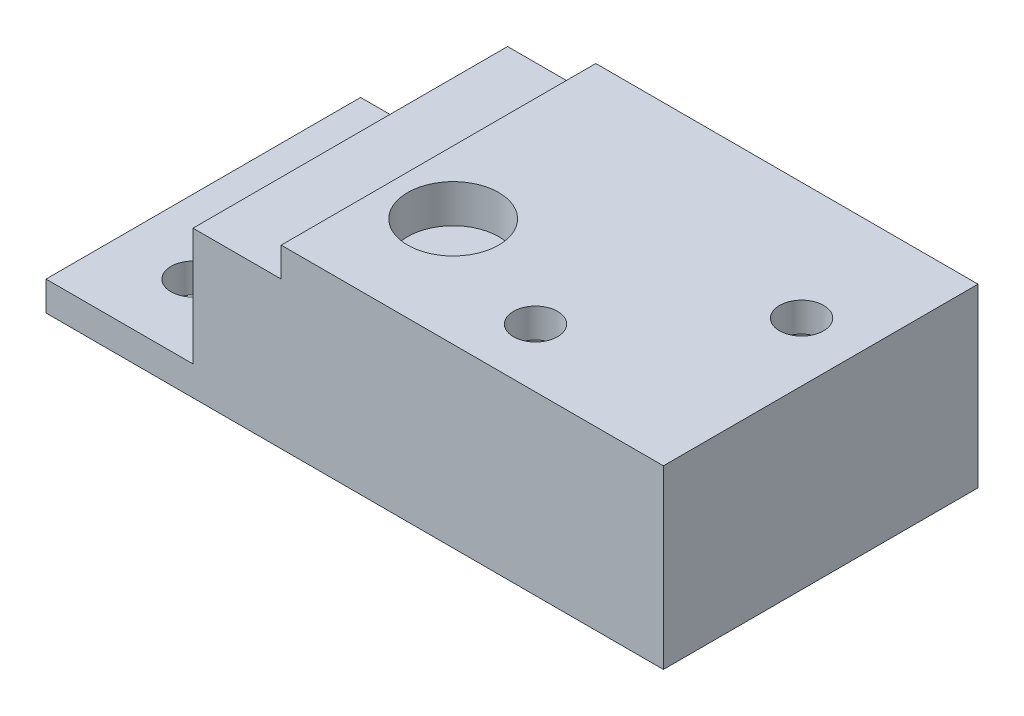
ISO-10303-21;
HEADER;
FILE_DESCRIPTION(('STEP AP214'),'2;1');
FILE_NAME('part.step','',(''),(''),'','','');
FILE_SCHEMA(('AUTOMOTIVE_DESIGN { 1 0 10303 214 1 1 1 1 }'));
ENDSEC;
DATA;
#1=APPLICATION_CONTEXT('core data for automotive mechanical design processes');
#2=APPLICATION_PROTOCOL_DEFINITION('international standard','automotive_design',2000,#1);
#3=PRODUCT_CONTEXT('',#1,'mechanical');
#4=PRODUCT('Part','Part','',(#3));
#5=PRODUCT_RELATED_PRODUCT_CATEGORY('part','',(#4));
#6=PRODUCT_DEFINITION_FORMATION('','',#4);
#7=PRODUCT_DEFINITION_CONTEXT('part definition',#1,'design');
#8=PRODUCT_DEFINITION('design','',#6,#7);
#9=PRODUCT_DEFINITION_SHAPE('','',#8);
#10=(LENGTH_UNIT() NAMED_UNIT(*) SI_UNIT(.MILLI.,.METRE.));
#11=(NAMED_UNIT(*) PLANE_ANGLE_UNIT() SI_UNIT($,.RADIAN.));
#12=(NAMED_UNIT(*) SI_UNIT($,.STERADIAN.) SOLID_ANGLE_UNIT());
#13=UNCERTAINTY_MEASURE_WITH_UNIT(LENGTH_MEASURE(1.E-05),#10,'distance_accuracy_value','');
#14=(GEOMETRIC_REPRESENTATION_CONTEXT(3) GLOBAL_UNCERTAINTY_ASSIGNED_CONTEXT((#13)) GLOBAL_UNIT_ASSIGNED_CONTEXT((#10,
#11,#12)) REPRESENTATION_CONTEXT('',''));
#15=CARTESIAN_POINT('',(0.,0.,0.));
#16=DIRECTION('',(0.,0.,1.));
#17=DIRECTION('',(1.,0.,0.));
#18=AXIS2_PLACEMENT_3D('',#15,#16,#17);
#19=CARTESIAN_POINT('',(0.,-32.,21.4));
#20=DIRECTION('',(0.,0.,-1.));
#21=DIRECTION('',(-1.,0.,0.));
#22=AXIS2_PLACEMENT_3D('',#19,#20,#21);
#23=PLANE('',#22);
#24=DIRECTION('',(0.,-1.,0.));
#25=VECTOR('',#24,1.);
#26=CARTESIAN_POINT('',(16.,-20.,21.4));
#27=LINE('',#26,#25);
#28=CARTESIAN_POINT('',(16.,-20.,21.4));
#29=VERTEX_POINT('',#28);
#30=CARTESIAN_POINT('',(16.,-22.,21.4));
#31=VERTEX_POINT('',#30);
#32=EDGE_CURVE('E127',#29,#31,#27,.T.);
#33=ORIENTED_EDGE('',*,*,#32,.T.);
#34=DIRECTION('',(1.,0.,0.));
#35=VECTOR('',#34,1.);
#36=CARTESIAN_POINT('',(10.,-22.,21.4));
#37=LINE('',#36,#35);
#38=CARTESIAN_POINT('',(10.,-22.,21.4));
#39=VERTEX_POINT('',#38);
#40=EDGE_CURVE('E132',#39,#31,#37,.T.);
#41=ORIENTED_EDGE('',*,*,#40,.F.);
#42=DIRECTION('',(0.,-1.,0.));
#43=VECTOR('',#42,1.);
#44=CARTESIAN_POINT('',(10.,-20.,21.4));
#45=LINE('',#44,#43);
#46=CARTESIAN_POINT('',(10.,-30.,21.4));
#47=VERTEX_POINT('',#46);
#48=EDGE_CURVE('E148',#39,#47,#45,.T.);
#49=ORIENTED_EDGE('',*,*,#48,.T.);
#50=DIRECTION('',(1.,0.,0.));
#51=VECTOR('',#50,1.);
#52=CARTESIAN_POINT('',(0.,-30.,21.4));
#53=LINE('',#52,#51);
#54=CARTESIAN_POINT('',(0.,-30.,21.4));
#55=VERTEX_POINT('',#54);
#56=EDGE_CURVE('E151',#55,#47,#53,.T.);
#57=ORIENTED_EDGE('',*,*,#56,.F.);
#58=DIRECTION('',(0.,1.,0.));
#59=VECTOR('',#58,1.);
#60=CARTESIAN_POINT('',(0.,-32.,21.4));
#61=LINE('',#60,#59);
#62=CARTESIAN_POINT('',(0.,-32.,21.4));
#63=VERTEX_POINT('',#62);
#64=EDGE_CURVE('E169',#63,#55,#61,.T.);
#65=ORIENTED_EDGE('',*,*,#64,.F.);
#66=DIRECTION('',(1.,0.,0.));
#67=VECTOR('',#66,1.);
#68=CARTESIAN_POINT('',(0.,-32.,21.4));
#69=LINE('',#68,#67);
#70=CARTESIAN_POINT('',(42.,-32.,21.4));
#71=VERTEX_POINT('',#70);
#72=EDGE_CURVE('E164',#63,#71,#69,.T.);
#73=ORIENTED_EDGE('',*,*,#72,.T.);
#74=DIRECTION('',(0.,1.,0.));
#75=VECTOR('',#74,1.);
#76=CARTESIAN_POINT('',(42.,-32.,21.4));
#77=LINE('',#76,#75);
#78=CARTESIAN_POINT('',(42.,-20.,21.4));
#79=VERTEX_POINT('',#78);
#80=EDGE_CURVE('E12',#71,#79,#77,.T.);
#81=ORIENTED_EDGE('',*,*,#80,.T.);
#82=DIRECTION('',(1.,0.,0.));
#83=VECTOR('',#82,1.);
#84=CARTESIAN_POINT('',(0.,-20.,21.4));
#85=LINE('',#84,#83);
#86=EDGE_CURVE('E119',#29,#79,#85,.T.);
#87=ORIENTED_EDGE('',*,*,#86,.F.);
#88=EDGE_LOOP('',(#33,#41,#49,#57,#65,#73,#81,#87));
#89=FACE_BOUND('',#88,.T.);
#90=ADVANCED_FACE('F43',(#89),#23,.F.);
#91=CARTESIAN_POINT('',(0.,-32.,0.));
#92=DIRECTION('',(0.,0.,-1.));
#93=DIRECTION('',(-1.,0.,0.));
#94=AXIS2_PLACEMENT_3D('',#91,#92,#93);
#95=PLANE('',#94);
#96=DIRECTION('',(1.,0.,0.));
#97=VECTOR('',#96,1.);
#98=CARTESIAN_POINT('',(0.,-20.,0.));
#99=LINE('',#98,#97);
#100=CARTESIAN_POINT('',(16.,-20.,0.));
#101=VERTEX_POINT('',#100);
#102=CARTESIAN_POINT('',(42.,-20.,0.));
#103=VERTEX_POINT('',#102);
#104=EDGE_CURVE('E121',#101,#103,#99,.T.);
#105=ORIENTED_EDGE('',*,*,#104,.T.);
#106=DIRECTION('',(0.,1.,0.));
#107=VECTOR('',#106,1.);
#108=CARTESIAN_POINT('',(42.,-32.,0.));
#109=LINE('',#108,#107);
#110=CARTESIAN_POINT('',(42.,-32.,0.));
#111=VERTEX_POINT('',#110);
#112=EDGE_CURVE('E51',#111,#103,#109,.T.);
#113=ORIENTED_EDGE('',*,*,#112,.F.);
#114=DIRECTION('',(1.,0.,0.));
#115=VECTOR('',#114,1.);
#116=CARTESIAN_POINT('',(0.,-32.,0.));
#117=LINE('',#116,#115);
#118=CARTESIAN_POINT('',(0.,-32.,0.));
#119=VERTEX_POINT('',#118);
#120=EDGE_CURVE('E167',#119,#111,#117,.T.);
#121=ORIENTED_EDGE('',*,*,#120,.F.);
#122=DIRECTION('',(0.,1.,0.));
#123=VECTOR('',#122,1.);
#124=CARTESIAN_POINT('',(0.,-32.,0.));
#125=LINE('',#124,#123);
#126=CARTESIAN_POINT('',(0.,-30.,0.));
#127=VERTEX_POINT('',#126);
#128=EDGE_CURVE('E174',#119,#127,#125,.T.);
#129=ORIENTED_EDGE('',*,*,#128,.T.);
#130=DIRECTION('',(1.,0.,0.));
#131=VECTOR('',#130,1.);
#132=CARTESIAN_POINT('',(0.,-30.,0.));
#133=LINE('',#132,#131);
#134=CARTESIAN_POINT('',(10.,-30.,0.));
#135=VERTEX_POINT('',#134);
#136=EDGE_CURVE('E152',#127,#135,#133,.T.);
#137=ORIENTED_EDGE('',*,*,#136,.T.);
#138=DIRECTION('',(0.,-1.,0.));
#139=VECTOR('',#138,1.);
#140=CARTESIAN_POINT('',(10.,-20.,0.));
#141=LINE('',#140,#139);
#142=CARTESIAN_POINT('',(10.,-22.,0.));
#143=VERTEX_POINT('',#142);
#144=EDGE_CURVE('E156',#143,#135,#141,.T.);
#145=ORIENTED_EDGE('',*,*,#144,.F.);
#146=DIRECTION('',(1.,0.,0.));
#147=VECTOR('',#146,1.);
#148=CARTESIAN_POINT('',(10.,-22.,0.));
#149=LINE('',#148,#147);
#150=CARTESIAN_POINT('',(16.,-22.,0.));
#151=VERTEX_POINT('',#150);
#152=EDGE_CURVE('E133',#143,#151,#149,.T.);
#153=ORIENTED_EDGE('',*,*,#152,.T.);
#154=DIRECTION('',(0.,-1.,0.));
#155=VECTOR('',#154,1.);
#156=CARTESIAN_POINT('',(16.,-20.,0.));
#157=LINE('',#156,#155);
#158=EDGE_CURVE('E138',#101,#151,#157,.T.);
#159=ORIENTED_EDGE('',*,*,#158,.F.);
#160=EDGE_LOOP('',(#105,#113,#121,#129,#137,#145,#153,#159));
#161=FACE_BOUND('',#160,.T.);
#162=ADVANCED_FACE('F243',(#161),#95,.T.);
#163=CARTESIAN_POINT('',(0.,-20.,0.));
#164=DIRECTION('',(0.,-1.,0.));
#165=DIRECTION('',(0.,0.,1.));
#166=AXIS2_PLACEMENT_3D('',#163,#164,#165);
#167=PLANE('',#166);
#168=CARTESIAN_POINT('',(38.,-20.,8.00000000000001));
#169=DIRECTION('',(0.,1.,0.));
#170=DIRECTION('',(0.,0.,1.));
#171=AXIS2_PLACEMENT_3D('',#168,#169,#170);
#172=CIRCLE('',#171,1.5);
#173=CARTESIAN_POINT('',(38.,-20.,9.50000000000002));
#174=VERTEX_POINT('',#173);
#175=EDGE_CURVE('E219',#174,#174,#172,.T.);
#176=ORIENTED_EDGE('',*,*,#175,.F.);
#177=EDGE_LOOP('',(#176));
#178=FACE_BOUND('',#177,.T.);
#179=CARTESIAN_POINT('',(29.3,-20.,17.4));
#180=DIRECTION('',(0.,1.,0.));
#181=DIRECTION('',(0.,0.,1.));
#182=AXIS2_PLACEMENT_3D('',#179,#180,#181);
#183=CIRCLE('',#182,1.5);
#184=CARTESIAN_POINT('',(29.3,-20.,18.9));
#185=VERTEX_POINT('',#184);
#186=EDGE_CURVE('E222',#185,#185,#183,.T.);
#187=ORIENTED_EDGE('',*,*,#186,.F.);
#188=EDGE_LOOP('',(#187));
#189=FACE_BOUND('',#188,.T.);
#190=CARTESIAN_POINT('',(20.3,-20.,14.));
#191=DIRECTION('',(0.,-1.,0.));
#192=DIRECTION('',(0.,0.,-1.));
#193=AXIS2_PLACEMENT_3D('',#190,#191,#192);
#194=CIRCLE('',#193,3.1);
#195=CARTESIAN_POINT('',(20.3,-20.,10.9));
#196=VERTEX_POINT('',#195);
#197=EDGE_CURVE('E141',#196,#196,#194,.T.);
#198=ORIENTED_EDGE('',*,*,#197,.T.);
#199=EDGE_LOOP('',(#198));
#200=FACE_BOUND('',#199,.T.);
#201=DIRECTION('',(0.,0.,-1.));
#202=VECTOR('',#201,1.);
#203=CARTESIAN_POINT('',(16.,-20.,21.4));
#204=LINE('',#203,#202);
#205=EDGE_CURVE('E59',#29,#101,#204,.T.);
#206=ORIENTED_EDGE('',*,*,#205,.F.);
#207=ORIENTED_EDGE('',*,*,#86,.T.);
#208=DIRECTION('',(0.,0.,-1.));
#209=VECTOR('',#208,1.);
#210=CARTESIAN_POINT('',(42.,-20.,0.));
#211=LINE('',#210,#209);
#212=EDGE_CURVE('E83',#79,#103,#211,.T.);
#213=ORIENTED_EDGE('',*,*,#212,.T.);
#214=ORIENTED_EDGE('',*,*,#104,.F.);
#215=EDGE_LOOP('',(#206,#207,#213,#214));
#216=FACE_BOUND('',#215,.T.);
#217=ADVANCED_FACE('F118',(#178,#189,#200,#216),#167,.F.);
#218=CARTESIAN_POINT('',(42.,-32.,0.));
#219=DIRECTION('',(-1.,0.,0.));
#220=DIRECTION('',(0.,0.,1.));
#221=AXIS2_PLACEMENT_3D('',#218,#219,#220);
#222=PLANE('',#221);
#223=ORIENTED_EDGE('',*,*,#212,.F.);
#224=ORIENTED_EDGE('',*,*,#80,.F.);
#225=DIRECTION('',(0.,0.,-1.));
#226=VECTOR('',#225,1.);
#227=CARTESIAN_POINT('',(42.,-32.,0.));
#228=LINE('',#227,#226);
#229=EDGE_CURVE('E90',#71,#111,#228,.T.);
#230=ORIENTED_EDGE('',*,*,#229,.T.);
#231=ORIENTED_EDGE('',*,*,#112,.T.);
#232=EDGE_LOOP('',(#223,#224,#230,#231));
#233=FACE_BOUND('',#232,.T.);
#234=ADVANCED_FACE('F252',(#233),#222,.F.);
#235=CARTESIAN_POINT('',(0.,-32.,0.));
#236=DIRECTION('',(-1.,0.,0.));
#237=DIRECTION('',(0.,0.,1.));
#238=AXIS2_PLACEMENT_3D('',#235,#236,#237);
#239=PLANE('',#238);
#240=DIRECTION('',(0.,0.,-1.));
#241=VECTOR('',#240,1.);
#242=CARTESIAN_POINT('',(0.,-30.,21.4));
#243=LINE('',#242,#241);
#244=EDGE_CURVE('E155',#55,#127,#243,.T.);
#245=ORIENTED_EDGE('',*,*,#244,.T.);
#246=ORIENTED_EDGE('',*,*,#128,.F.);
#247=DIRECTION('',(0.,0.,-1.));
#248=VECTOR('',#247,1.);
#249=CARTESIAN_POINT('',(0.,-32.,0.));
#250=LINE('',#249,#248);
#251=EDGE_CURVE('E68',#63,#119,#250,.T.);
#252=ORIENTED_EDGE('',*,*,#251,.F.);
#253=ORIENTED_EDGE('',*,*,#64,.T.);
#254=EDGE_LOOP('',(#245,#246,#252,#253));
#255=FACE_BOUND('',#254,.T.);
#256=ADVANCED_FACE('F256',(#255),#239,.T.);
#257=CARTESIAN_POINT('',(0.,-32.,0.));
#258=DIRECTION('',(0.,-1.,0.));
#259=DIRECTION('',(0.,0.,1.));
#260=AXIS2_PLACEMENT_3D('',#257,#258,#259);
#261=PLANE('',#260);
#262=CARTESIAN_POINT('',(4.99999999999999,-32.,16.4));
#263=DIRECTION('',(0.,1.,0.));
#264=DIRECTION('',(0.,0.,1.));
#265=AXIS2_PLACEMENT_3D('',#262,#263,#264);
#266=CIRCLE('',#265,1.5);
#267=CARTESIAN_POINT('',(4.99999999999999,-32.,17.9));
#268=VERTEX_POINT('',#267);
#269=EDGE_CURVE('E218',#268,#268,#266,.T.);
#270=ORIENTED_EDGE('',*,*,#269,.T.);
#271=EDGE_LOOP('',(#270));
#272=FACE_BOUND('',#271,.T.);
#273=CARTESIAN_POINT('',(4.99999999999999,-32.,5.00000000000003));
#274=DIRECTION('',(0.,1.,0.));
#275=DIRECTION('',(0.,0.,1.));
#276=AXIS2_PLACEMENT_3D('',#273,#274,#275);
#277=CIRCLE('',#276,1.5);
#278=CARTESIAN_POINT('',(4.99999999999999,-32.,6.50000000000003));
#279=VERTEX_POINT('',#278);
#280=EDGE_CURVE('E182',#279,#279,#277,.T.);
#281=ORIENTED_EDGE('',*,*,#280,.T.);
#282=EDGE_LOOP('',(#281));
#283=FACE_BOUND('',#282,.T.);
#284=CARTESIAN_POINT('',(38.,-32.,8.00000000000001));
#285=DIRECTION('',(0.,1.,0.));
#286=DIRECTION('',(0.,0.,1.));
#287=AXIS2_PLACEMENT_3D('',#284,#285,#286);
#288=CIRCLE('',#287,2.25);
#289=CARTESIAN_POINT('',(38.,-32.,10.25));
#290=VERTEX_POINT('',#289);
#291=EDGE_CURVE('E198',#290,#290,#288,.T.);
#292=ORIENTED_EDGE('',*,*,#291,.T.);
#293=EDGE_LOOP('',(#292));
#294=FACE_BOUND('',#293,.T.);
#295=CARTESIAN_POINT('',(29.3,-32.,17.4));
#296=DIRECTION('',(0.,1.,0.));
#297=DIRECTION('',(0.,0.,1.));
#298=AXIS2_PLACEMENT_3D('',#295,#296,#297);
#299=CIRCLE('',#298,2.25000000000001);
#300=CARTESIAN_POINT('',(29.3,-32.,19.65));
#301=VERTEX_POINT('',#300);
#302=EDGE_CURVE('E193',#301,#301,#299,.T.);
#303=ORIENTED_EDGE('',*,*,#302,.T.);
#304=EDGE_LOOP('',(#303));
#305=FACE_BOUND('',#304,.T.);
#306=ORIENTED_EDGE('',*,*,#72,.F.);
#307=ORIENTED_EDGE('',*,*,#251,.T.);
#308=ORIENTED_EDGE('',*,*,#120,.T.);
#309=ORIENTED_EDGE('',*,*,#229,.F.);
#310=EDGE_LOOP('',(#306,#307,#308,#309));
#311=FACE_BOUND('',#310,.T.);
#312=ADVANCED_FACE('F228',(#272,#283,#294,#305,#311),#261,.T.);
#313=CARTESIAN_POINT('',(16.,-20.,21.4));
#314=DIRECTION('',(-1.,0.,0.));
#315=DIRECTION('',(0.,0.,1.));
#316=AXIS2_PLACEMENT_3D('',#313,#314,#315);
#317=PLANE('',#316);
#318=ORIENTED_EDGE('',*,*,#158,.T.);
#319=DIRECTION('',(0.,0.,-1.));
#320=VECTOR('',#319,1.);
#321=CARTESIAN_POINT('',(16.,-22.,21.4));
#322=LINE('',#321,#320);
#323=EDGE_CURVE('E122',#31,#151,#322,.T.);
#324=ORIENTED_EDGE('',*,*,#323,.F.);
#325=ORIENTED_EDGE('',*,*,#32,.F.);
#326=ORIENTED_EDGE('',*,*,#205,.T.);
#327=EDGE_LOOP('',(#318,#324,#325,#326));
#328=FACE_BOUND('',#327,.T.);
#329=ADVANCED_FACE('F130',(#328),#317,.T.);
#330=CARTESIAN_POINT('',(10.,-22.,21.4));
#331=DIRECTION('',(0.,-1.,0.));
#332=DIRECTION('',(-1.,0.,0.));
#333=AXIS2_PLACEMENT_3D('',#330,#331,#332);
#334=PLANE('',#333);
#335=ORIENTED_EDGE('',*,*,#152,.F.);
#336=DIRECTION('',(0.,0.,-1.));
#337=VECTOR('',#336,1.);
#338=CARTESIAN_POINT('',(10.,-22.,21.4));
#339=LINE('',#338,#337);
#340=EDGE_CURVE('E135',#39,#143,#339,.T.);
#341=ORIENTED_EDGE('',*,*,#340,.F.);
#342=ORIENTED_EDGE('',*,*,#40,.T.);
#343=ORIENTED_EDGE('',*,*,#323,.T.);
#344=EDGE_LOOP('',(#335,#341,#342,#343));
#345=FACE_BOUND('',#344,.T.);
#346=ADVANCED_FACE('F267',(#345),#334,.F.);
#347=CARTESIAN_POINT('',(0.,-30.,21.4));
#348=DIRECTION('',(0.,-1.,0.));
#349=DIRECTION('',(-1.,0.,0.));
#350=AXIS2_PLACEMENT_3D('',#347,#348,#349);
#351=PLANE('',#350);
#352=CARTESIAN_POINT('',(4.99999999999999,-30.,16.4));
#353=DIRECTION('',(0.,1.,0.));
#354=DIRECTION('',(-1.,0.,0.));
#355=AXIS2_PLACEMENT_3D('',#352,#353,#354);
#356=CIRCLE('',#355,1.5);
#357=CARTESIAN_POINT('',(4.99999999999999,-30.,17.9));
#358=VERTEX_POINT('',#357);
#359=EDGE_CURVE('E46',#358,#358,#356,.T.);
#360=ORIENTED_EDGE('',*,*,#359,.F.);
#361=EDGE_LOOP('',(#360));
#362=FACE_BOUND('',#361,.T.);
#363=CARTESIAN_POINT('',(4.99999999999999,-30.,5.00000000000003));
#364=DIRECTION('',(0.,1.,0.));
#365=DIRECTION('',(-1.,0.,0.));
#366=AXIS2_PLACEMENT_3D('',#363,#364,#365);
#367=CIRCLE('',#366,1.5);
#368=CARTESIAN_POINT('',(4.99999999999999,-30.,6.50000000000003));
#369=VERTEX_POINT('',#368);
#370=EDGE_CURVE('E184',#369,#369,#367,.T.);
#371=ORIENTED_EDGE('',*,*,#370,.F.);
#372=EDGE_LOOP('',(#371));
#373=FACE_BOUND('',#372,.T.);
#374=ORIENTED_EDGE('',*,*,#136,.F.);
#375=ORIENTED_EDGE('',*,*,#244,.F.);
#376=ORIENTED_EDGE('',*,*,#56,.T.);
#377=DIRECTION('',(0.,0.,-1.));
#378=VECTOR('',#377,1.);
#379=CARTESIAN_POINT('',(10.,-30.,21.4));
#380=LINE('',#379,#378);
#381=EDGE_CURVE('E144',#47,#135,#380,.T.);
#382=ORIENTED_EDGE('',*,*,#381,.T.);
#383=EDGE_LOOP('',(#374,#375,#376,#382));
#384=FACE_BOUND('',#383,.T.);
#385=ADVANCED_FACE('F275',(#362,#373,#384),#351,.F.);
#386=CARTESIAN_POINT('',(10.,-20.,21.4));
#387=DIRECTION('',(-1.,0.,0.));
#388=DIRECTION('',(0.,0.,1.));
#389=AXIS2_PLACEMENT_3D('',#386,#387,#388);
#390=PLANE('',#389);
#391=ORIENTED_EDGE('',*,*,#48,.F.);
#392=ORIENTED_EDGE('',*,*,#340,.T.);
#393=ORIENTED_EDGE('',*,*,#144,.T.);
#394=ORIENTED_EDGE('',*,*,#381,.F.);
#395=EDGE_LOOP('',(#391,#392,#393,#394));
#396=FACE_BOUND('',#395,.T.);
#397=ADVANCED_FACE('F272',(#396),#390,.T.);
#398=CARTESIAN_POINT('',(20.3,-22.6,14.));
#399=DIRECTION('',(0.,1.,0.));
#400=DIRECTION('',(0.,0.,-1.));
#401=AXIS2_PLACEMENT_3D('',#398,#399,#400);
#402=CYLINDRICAL_SURFACE('',#401,3.1);
#403=CARTESIAN_POINT('',(20.3,-22.6,14.));
#404=DIRECTION('',(0.,-1.,0.));
#405=DIRECTION('',(0.,0.,-1.));
#406=AXIS2_PLACEMENT_3D('',#403,#404,#405);
#407=CIRCLE('',#406,3.1);
#408=CARTESIAN_POINT('',(20.3,-22.6,10.9));
#409=VERTEX_POINT('',#408);
#410=EDGE_CURVE('E159',#409,#409,#407,.T.);
#411=ORIENTED_EDGE('',*,*,#410,.T.);
#412=EDGE_LOOP('',(#411));
#413=FACE_BOUND('',#412,.T.);
#414=ORIENTED_EDGE('',*,*,#197,.F.);
#415=EDGE_LOOP('',(#414));
#416=FACE_BOUND('',#415,.T.);
#417=ADVANCED_FACE('F285',(#413,#416),#402,.F.);
#418=CARTESIAN_POINT('',(20.3,-22.6,14.));
#419=DIRECTION('',(0.,1.,0.));
#420=DIRECTION('',(0.,0.,-1.));
#421=AXIS2_PLACEMENT_3D('',#418,#419,#420);
#422=PLANE('',#421);
#423=ORIENTED_EDGE('',*,*,#410,.F.);
#424=EDGE_LOOP('',(#423));
#425=FACE_BOUND('',#424,.T.);
#426=ADVANCED_FACE('F293',(#425),#422,.T.);
#427=CARTESIAN_POINT('',(29.3,-13.6360389693211,17.4));
#428=DIRECTION('',(0.,-1.,0.));
#429=DIRECTION('',(0.,0.,1.));
#430=AXIS2_PLACEMENT_3D('',#427,#428,#429);
#431=CYLINDRICAL_SURFACE('',#430,2.25000000000001);
#432=CARTESIAN_POINT('',(29.3,-22.,17.4));
#433=DIRECTION('',(0.,1.,0.));
#434=DIRECTION('',(0.,0.,1.));
#435=AXIS2_PLACEMENT_3D('',#432,#433,#434);
#436=CIRCLE('',#435,2.25000000000001);
#437=CARTESIAN_POINT('',(29.3,-22.,19.65));
#438=VERTEX_POINT('',#437);
#439=EDGE_CURVE('E189',#438,#438,#436,.F.);
#440=ORIENTED_EDGE('',*,*,#439,.F.);
#441=EDGE_LOOP('',(#440));
#442=FACE_BOUND('',#441,.T.);
#443=ORIENTED_EDGE('',*,*,#302,.F.);
#444=EDGE_LOOP('',(#443));
#445=FACE_BOUND('',#444,.T.);
#446=ADVANCED_FACE('F296',(#442,#445),#431,.F.);
#447=CARTESIAN_POINT('',(0.,-22.,0.));
#448=DIRECTION('',(0.,-1.,0.));
#449=DIRECTION('',(0.,0.,1.));
#450=AXIS2_PLACEMENT_3D('',#447,#448,#449);
#451=PLANE('',#450);
#452=CARTESIAN_POINT('',(29.3,-22.,17.4));
#453=DIRECTION('',(0.,1.,0.));
#454=DIRECTION('',(0.,0.,1.));
#455=AXIS2_PLACEMENT_3D('',#452,#453,#454);
#456=CIRCLE('',#455,1.5);
#457=CARTESIAN_POINT('',(29.3,-22.,18.9));
#458=VERTEX_POINT('',#457);
#459=EDGE_CURVE('E181',#458,#458,#456,.T.);
#460=ORIENTED_EDGE('',*,*,#459,.T.);
#461=EDGE_LOOP('',(#460));
#462=FACE_BOUND('',#461,.T.);
#463=ORIENTED_EDGE('',*,*,#439,.T.);
#464=EDGE_LOOP('',(#463));
#465=FACE_BOUND('',#464,.T.);
#466=ADVANCED_FACE('F298',(#462,#465),#451,.T.);
#467=CARTESIAN_POINT('',(38.,-13.6360389693211,8.00000000000001));
#468=DIRECTION('',(0.,-1.,0.));
#469=DIRECTION('',(0.,0.,1.));
#470=AXIS2_PLACEMENT_3D('',#467,#468,#469);
#471=CYLINDRICAL_SURFACE('',#470,2.25);
#472=CARTESIAN_POINT('',(38.,-22.,8.00000000000001));
#473=DIRECTION('',(0.,1.,0.));
#474=DIRECTION('',(0.,0.,1.));
#475=AXIS2_PLACEMENT_3D('',#472,#473,#474);
#476=CIRCLE('',#475,2.25);
#477=CARTESIAN_POINT('',(38.,-22.,10.25));
#478=VERTEX_POINT('',#477);
#479=EDGE_CURVE('E201',#478,#478,#476,.F.);
#480=ORIENTED_EDGE('',*,*,#479,.F.);
#481=EDGE_LOOP('',(#480));
#482=FACE_BOUND('',#481,.T.);
#483=ORIENTED_EDGE('',*,*,#291,.F.);
#484=EDGE_LOOP('',(#483));
#485=FACE_BOUND('',#484,.T.);
#486=ADVANCED_FACE('F301',(#482,#485),#471,.F.);
#487=CARTESIAN_POINT('',(0.,-22.,0.));
#488=DIRECTION('',(0.,-1.,0.));
#489=DIRECTION('',(0.,0.,1.));
#490=AXIS2_PLACEMENT_3D('',#487,#488,#489);
#491=PLANE('',#490);
#492=CARTESIAN_POINT('',(38.,-22.,8.00000000000001));
#493=DIRECTION('',(0.,1.,0.));
#494=DIRECTION('',(0.,0.,1.));
#495=AXIS2_PLACEMENT_3D('',#492,#493,#494);
#496=CIRCLE('',#495,1.5);
#497=CARTESIAN_POINT('',(38.,-22.,9.50000000000002));
#498=VERTEX_POINT('',#497);
#499=EDGE_CURVE('E178',#498,#498,#496,.T.);
#500=ORIENTED_EDGE('',*,*,#499,.T.);
#501=EDGE_LOOP('',(#500));
#502=FACE_BOUND('',#501,.T.);
#503=ORIENTED_EDGE('',*,*,#479,.T.);
#504=EDGE_LOOP('',(#503));
#505=FACE_BOUND('',#504,.T.);
#506=ADVANCED_FACE('F308',(#502,#505),#491,.T.);
#507=CARTESIAN_POINT('',(38.,-20.,8.00000000000001));
#508=DIRECTION('',(0.,-1.,0.));
#509=DIRECTION('',(0.,0.,1.));
#510=AXIS2_PLACEMENT_3D('',#507,#508,#509);
#511=CYLINDRICAL_SURFACE('',#510,1.5);
#512=CARTESIAN_POINT('',(38.,-22.,9.50000000000002));
#513=CARTESIAN_POINT('',(38.,-21.9791666666667,9.50000000000002));
#514=CARTESIAN_POINT('',(38.,-21.9583333333333,9.50000000000002));
#515=CARTESIAN_POINT('',(38.,-21.9166666666667,9.50000000000002));
#516=CARTESIAN_POINT('',(38.,-21.8958333333333,9.50000000000002));
#517=CARTESIAN_POINT('',(38.,-21.8541666666667,9.50000000000002));
#518=CARTESIAN_POINT('',(38.,-21.8333333333333,9.50000000000002));
#519=CARTESIAN_POINT('',(38.,-21.7916666666667,9.50000000000002));
#520=CARTESIAN_POINT('',(38.,-21.7708333333333,9.50000000000002));
#521=CARTESIAN_POINT('',(38.,-21.7291666666667,9.50000000000002));
#522=CARTESIAN_POINT('',(38.,-21.7083333333333,9.50000000000002));
#523=CARTESIAN_POINT('',(38.,-21.6666666666667,9.50000000000002));
#524=CARTESIAN_POINT('',(38.,-21.6458333333333,9.50000000000002));
#525=CARTESIAN_POINT('',(38.,-21.6041666666667,9.50000000000002));
#526=CARTESIAN_POINT('',(38.,-21.5833333333333,9.50000000000002));
#527=CARTESIAN_POINT('',(38.,-21.5416666666667,9.50000000000002));
#528=CARTESIAN_POINT('',(38.,-21.5208333333333,9.50000000000002));
#529=CARTESIAN_POINT('',(38.,-21.4791666666667,9.50000000000002));
#530=CARTESIAN_POINT('',(38.,-21.4583333333333,9.50000000000002));
#531=CARTESIAN_POINT('',(38.,-21.4166666666667,9.50000000000002));
#532=CARTESIAN_POINT('',(38.,-21.3958333333333,9.50000000000002));
#533=CARTESIAN_POINT('',(38.,-21.3541666666667,9.50000000000002));
#534=CARTESIAN_POINT('',(38.,-21.3333333333333,9.50000000000002));
#535=CARTESIAN_POINT('',(38.,-21.2916666666667,9.50000000000002));
#536=CARTESIAN_POINT('',(38.,-21.2708333333333,9.50000000000002));
#537=CARTESIAN_POINT('',(38.,-21.2291666666667,9.50000000000002));
#538=CARTESIAN_POINT('',(38.,-21.2083333333333,9.50000000000002));
#539=CARTESIAN_POINT('',(38.,-21.1666666666667,9.50000000000002));
#540=CARTESIAN_POINT('',(38.,-21.1458333333333,9.50000000000002));
#541=CARTESIAN_POINT('',(38.,-21.1041666666667,9.50000000000002));
#542=CARTESIAN_POINT('',(38.,-21.0833333333333,9.50000000000002));
#543=CARTESIAN_POINT('',(38.,-21.0416666666667,9.50000000000002));
#544=CARTESIAN_POINT('',(38.,-21.0208333333333,9.50000000000002));
#545=CARTESIAN_POINT('',(38.,-20.9791666666667,9.50000000000002));
#546=CARTESIAN_POINT('',(38.,-20.9583333333333,9.50000000000002));
#547=CARTESIAN_POINT('',(38.,-20.9166666666667,9.50000000000002));
#548=CARTESIAN_POINT('',(38.,-20.8958333333333,9.50000000000002));
#549=CARTESIAN_POINT('',(38.,-20.8541666666667,9.50000000000002));
#550=CARTESIAN_POINT('',(38.,-20.8333333333333,9.50000000000002));
#551=CARTESIAN_POINT('',(38.,-20.7916666666667,9.50000000000002));
#552=CARTESIAN_POINT('',(38.,-20.7708333333333,9.50000000000002));
#553=CARTESIAN_POINT('',(38.,-20.7291666666667,9.50000000000002));
#554=CARTESIAN_POINT('',(38.,-20.7083333333333,9.50000000000002));
#555=CARTESIAN_POINT('',(38.,-20.6666666666667,9.50000000000002));
#556=CARTESIAN_POINT('',(38.,-20.6458333333333,9.50000000000002));
#557=CARTESIAN_POINT('',(38.,-20.6041666666667,9.50000000000002));
#558=CARTESIAN_POINT('',(38.,-20.5833333333333,9.50000000000002));
#559=CARTESIAN_POINT('',(38.,-20.5416666666667,9.50000000000002));
#560=CARTESIAN_POINT('',(38.,-20.5208333333333,9.50000000000002));
#561=CARTESIAN_POINT('',(38.,-20.4791666666667,9.50000000000002));
#562=CARTESIAN_POINT('',(38.,-20.4583333333333,9.50000000000002));
#563=CARTESIAN_POINT('',(38.,-20.4166666666667,9.50000000000002));
#564=CARTESIAN_POINT('',(38.,-20.3958333333333,9.50000000000002));
#565=CARTESIAN_POINT('',(38.,-20.3541666666667,9.50000000000002));
#566=CARTESIAN_POINT('',(38.,-20.3333333333333,9.50000000000002));
#567=CARTESIAN_POINT('',(38.,-20.2916666666667,9.50000000000002));
#568=CARTESIAN_POINT('',(38.,-20.2708333333333,9.50000000000002));
#569=CARTESIAN_POINT('',(38.,-20.2291666666667,9.50000000000002));
#570=CARTESIAN_POINT('',(38.,-20.2083333333333,9.50000000000002));
#571=CARTESIAN_POINT('',(38.,-20.1666666666667,9.50000000000002));
#572=CARTESIAN_POINT('',(38.,-20.1458333333333,9.50000000000002));
#573=CARTESIAN_POINT('',(38.,-20.1041666666667,9.50000000000002));
#574=CARTESIAN_POINT('',(38.,-20.0833333333333,9.50000000000002));
#575=CARTESIAN_POINT('',(38.,-20.0416666666667,9.50000000000002));
#576=CARTESIAN_POINT('',(38.,-20.0208333333333,9.50000000000002));
#577=CARTESIAN_POINT('',(38.,-20.,9.50000000000002));
#578=B_SPLINE_CURVE_WITH_KNOTS('',3,(#512,#513,#514,#515,#516,#517,#518,#519,#520,#521,#522,
#523,#524,#525,#526,#527,#528,#529,#530,#531,#532,#533,#534,#535,#536,#537,#538,#539,#540,#541,
#542,#543,#544,#545,#546,#547,#548,#549,#550,#551,#552,#553,#554,#555,#556,#557,#558,#559,#560,
#561,#562,#563,#564,#565,#566,#567,#568,#569,#570,#571,#572,#573,#574,#575,#576,#577),
.UNSPECIFIED.,.F.,.F.,(4,2,2,2,2,2,2,2,2,2,2,2,2,2,2,2,2,2,2,2,2,2,2,2,2,2,2,2,2,2,2,2,4),(0.,
0.0625000000000001,0.125,0.1875,0.25,0.3125,0.375,0.4375,0.5,0.5625,0.625000000000001,
0.687500000000001,0.750000000000001,0.812500000000001,0.875000000000001,0.937500000000001,1.,
1.0625,1.125,1.1875,1.25,1.3125,1.375,1.4375,1.5,1.5625,1.625,1.6875,1.75000000000001,
1.81250000000001,1.87500000000001,1.93750000000001,2.00000000000001),.UNSPECIFIED.);
#579=EDGE_CURVE('BSEAM311',#498,#174,#578,.T.);
#580=ORIENTED_EDGE('',*,*,#499,.F.);
#581=ORIENTED_EDGE('',*,*,#175,.T.);
#582=ORIENTED_EDGE('',*,*,#579,.T.);
#583=ORIENTED_EDGE('',*,*,#579,.F.);
#584=EDGE_LOOP('',(#580,#582,#581,#583));
#585=FACE_BOUND('',#584,.T.);
#586=ADVANCED_FACE('F311',(#585),#511,.F.);
#587=CARTESIAN_POINT('',(29.3,-20.,17.4));
#588=DIRECTION('',(0.,-1.,0.));
#589=DIRECTION('',(0.,0.,1.));
#590=AXIS2_PLACEMENT_3D('',#587,#588,#589);
#591=CYLINDRICAL_SURFACE('',#590,1.5);
#592=CARTESIAN_POINT('',(29.3,-22.,18.9));
#593=CARTESIAN_POINT('',(29.3,-21.9791666666667,18.9));
#594=CARTESIAN_POINT('',(29.3,-21.9583333333333,18.9));
#595=CARTESIAN_POINT('',(29.3,-21.9166666666667,18.9));
#596=CARTESIAN_POINT('',(29.3,-21.8958333333333,18.9));
#597=CARTESIAN_POINT('',(29.3,-21.8541666666667,18.9));
#598=CARTESIAN_POINT('',(29.3,-21.8333333333333,18.9));
#599=CARTESIAN_POINT('',(29.3,-21.7916666666667,18.9));
#600=CARTESIAN_POINT('',(29.3,-21.7708333333333,18.9));
#601=CARTESIAN_POINT('',(29.3,-21.7291666666667,18.9));
#602=CARTESIAN_POINT('',(29.3,-21.7083333333333,18.9));
#603=CARTESIAN_POINT('',(29.3,-21.6666666666667,18.9));
#604=CARTESIAN_POINT('',(29.3,-21.6458333333333,18.9));
#605=CARTESIAN_POINT('',(29.3,-21.6041666666667,18.9));
#606=CARTESIAN_POINT('',(29.3,-21.5833333333333,18.9));
#607=CARTESIAN_POINT('',(29.3,-21.5416666666667,18.9));
#608=CARTESIAN_POINT('',(29.3,-21.5208333333333,18.9));
#609=CARTESIAN_POINT('',(29.3,-21.4791666666667,18.9));
#610=CARTESIAN_POINT('',(29.3,-21.4583333333333,18.9));
#611=CARTESIAN_POINT('',(29.3,-21.4166666666667,18.9));
#612=CARTESIAN_POINT('',(29.3,-21.3958333333333,18.9));
#613=CARTESIAN_POINT('',(29.3,-21.3541666666667,18.9));
#614=CARTESIAN_POINT('',(29.3,-21.3333333333333,18.9));
#615=CARTESIAN_POINT('',(29.3,-21.2916666666667,18.9));
#616=CARTESIAN_POINT('',(29.3,-21.2708333333333,18.9));
#617=CARTESIAN_POINT('',(29.3,-21.2291666666667,18.9));
#618=CARTESIAN_POINT('',(29.3,-21.2083333333333,18.9));
#619=CARTESIAN_POINT('',(29.3,-21.1666666666667,18.9));
#620=CARTESIAN_POINT('',(29.3,-21.1458333333333,18.9));
#621=CARTESIAN_POINT('',(29.3,-21.1041666666667,18.9));
#622=CARTESIAN_POINT('',(29.3,-21.0833333333333,18.9));
#623=CARTESIAN_POINT('',(29.3,-21.0416666666667,18.9));
#624=CARTESIAN_POINT('',(29.3,-21.0208333333333,18.9));
#625=CARTESIAN_POINT('',(29.3,-20.9791666666667,18.9));
#626=CARTESIAN_POINT('',(29.3,-20.9583333333333,18.9));
#627=CARTESIAN_POINT('',(29.3,-20.9166666666667,18.9));
#628=CARTESIAN_POINT('',(29.3,-20.8958333333333,18.9));
#629=CARTESIAN_POINT('',(29.3,-20.8541666666667,18.9));
#630=CARTESIAN_POINT('',(29.3,-20.8333333333333,18.9));
#631=CARTESIAN_POINT('',(29.3,-20.7916666666667,18.9));
#632=CARTESIAN_POINT('',(29.3,-20.7708333333333,18.9));
#633=CARTESIAN_POINT('',(29.3,-20.7291666666667,18.9));
#634=CARTESIAN_POINT('',(29.3,-20.7083333333333,18.9));
#635=CARTESIAN_POINT('',(29.3,-20.6666666666667,18.9));
#636=CARTESIAN_POINT('',(29.3,-20.6458333333333,18.9));
#637=CARTESIAN_POINT('',(29.3,-20.6041666666667,18.9));
#638=CARTESIAN_POINT('',(29.3,-20.5833333333333,18.9));
#639=CARTESIAN_POINT('',(29.3,-20.5416666666667,18.9));
#640=CARTESIAN_POINT('',(29.3,-20.5208333333333,18.9));
#641=CARTESIAN_POINT('',(29.3,-20.4791666666667,18.9));
#642=CARTESIAN_POINT('',(29.3,-20.4583333333333,18.9));
#643=CARTESIAN_POINT('',(29.3,-20.4166666666667,18.9));
#644=CARTESIAN_POINT('',(29.3,-20.3958333333333,18.9));
#645=CARTESIAN_POINT('',(29.3,-20.3541666666667,18.9));
#646=CARTESIAN_POINT('',(29.3,-20.3333333333333,18.9));
#647=CARTESIAN_POINT('',(29.3,-20.2916666666667,18.9));
#648=CARTESIAN_POINT('',(29.3,-20.2708333333333,18.9));
#649=CARTESIAN_POINT('',(29.3,-20.2291666666667,18.9));
#650=CARTESIAN_POINT('',(29.3,-20.2083333333333,18.9));
#651=CARTESIAN_POINT('',(29.3,-20.1666666666667,18.9));
#652=CARTESIAN_POINT('',(29.3,-20.1458333333333,18.9));
#653=CARTESIAN_POINT('',(29.3,-20.1041666666667,18.9));
#654=CARTESIAN_POINT('',(29.3,-20.0833333333333,18.9));
#655=CARTESIAN_POINT('',(29.3,-20.0416666666667,18.9));
#656=CARTESIAN_POINT('',(29.3,-20.0208333333333,18.9));
#657=CARTESIAN_POINT('',(29.3,-20.,18.9));
#658=B_SPLINE_CURVE_WITH_KNOTS('',3,(#592,#593,#594,#595,#596,#597,#598,#599,#600,#601,#602,
#603,#604,#605,#606,#607,#608,#609,#610,#611,#612,#613,#614,#615,#616,#617,#618,#619,#620,#621,
#622,#623,#624,#625,#626,#627,#628,#629,#630,#631,#632,#633,#634,#635,#636,#637,#638,#639,#640,
#641,#642,#643,#644,#645,#646,#647,#648,#649,#650,#651,#652,#653,#654,#655,#656,#657),
.UNSPECIFIED.,.F.,.F.,(4,2,2,2,2,2,2,2,2,2,2,2,2,2,2,2,2,2,2,2,2,2,2,2,2,2,2,2,2,2,2,2,4),(0.,
0.0625000000000001,0.125,0.1875,0.25,0.3125,0.375,0.4375,0.5,0.5625,0.625000000000001,
0.687500000000001,0.750000000000001,0.812500000000001,0.875000000000001,0.937500000000001,1.,
1.0625,1.125,1.1875,1.25,1.3125,1.375,1.4375,1.5,1.5625,1.625,1.6875,1.75000000000001,
1.81250000000001,1.87500000000001,1.93750000000001,2.00000000000001),.UNSPECIFIED.);
#659=EDGE_CURVE('BSEAM238',#458,#185,#658,.T.);
#660=ORIENTED_EDGE('',*,*,#459,.F.);
#661=ORIENTED_EDGE('',*,*,#186,.T.);
#662=ORIENTED_EDGE('',*,*,#659,.T.);
#663=ORIENTED_EDGE('',*,*,#659,.F.);
#664=EDGE_LOOP('',(#660,#662,#661,#663));
#665=FACE_BOUND('',#664,.T.);
#666=ADVANCED_FACE('F238',(#665),#591,.F.);
#667=CARTESIAN_POINT('',(4.99999999999999,-20.,5.00000000000003));
#668=DIRECTION('',(0.,-1.,0.));
#669=DIRECTION('',(0.,0.,1.));
#670=AXIS2_PLACEMENT_3D('',#667,#668,#669);
#671=CYLINDRICAL_SURFACE('',#670,1.5);
#672=CARTESIAN_POINT('',(4.99999999999999,-32.,6.50000000000003));
#673=CARTESIAN_POINT('',(4.99999999999999,-31.9791666666667,6.50000000000003));
#674=CARTESIAN_POINT('',(4.99999999999999,-31.9583333333333,6.50000000000003));
#675=CARTESIAN_POINT('',(4.99999999999999,-31.9166666666667,6.50000000000003));
#676=CARTESIAN_POINT('',(4.99999999999999,-31.8958333333333,6.50000000000003));
#677=CARTESIAN_POINT('',(4.99999999999999,-31.8541666666667,6.50000000000003));
#678=CARTESIAN_POINT('',(4.99999999999999,-31.8333333333333,6.50000000000003));
#679=CARTESIAN_POINT('',(4.99999999999999,-31.7916666666667,6.50000000000003));
#680=CARTESIAN_POINT('',(4.99999999999999,-31.7708333333333,6.50000000000003));
#681=CARTESIAN_POINT('',(4.99999999999999,-31.7291666666667,6.50000000000003));
#682=CARTESIAN_POINT('',(4.99999999999999,-31.7083333333333,6.50000000000003));
#683=CARTESIAN_POINT('',(4.99999999999999,-31.6666666666667,6.50000000000003));
#684=CARTESIAN_POINT('',(4.99999999999999,-31.6458333333333,6.50000000000003));
#685=CARTESIAN_POINT('',(4.99999999999999,-31.6041666666667,6.50000000000003));
#686=CARTESIAN_POINT('',(4.99999999999999,-31.5833333333333,6.50000000000003));
#687=CARTESIAN_POINT('',(4.99999999999999,-31.5416666666667,6.50000000000003));
#688=CARTESIAN_POINT('',(4.99999999999999,-31.5208333333333,6.50000000000003));
#689=CARTESIAN_POINT('',(4.99999999999999,-31.4791666666667,6.50000000000003));
#690=CARTESIAN_POINT('',(4.99999999999999,-31.4583333333333,6.50000000000003));
#691=CARTESIAN_POINT('',(4.99999999999999,-31.4166666666667,6.50000000000003));
#692=CARTESIAN_POINT('',(4.99999999999999,-31.3958333333333,6.50000000000003));
#693=CARTESIAN_POINT('',(4.99999999999999,-31.3541666666667,6.50000000000003));
#694=CARTESIAN_POINT('',(4.99999999999999,-31.3333333333333,6.50000000000003));
#695=CARTESIAN_POINT('',(4.99999999999999,-31.2916666666667,6.50000000000003));
#696=CARTESIAN_POINT('',(4.99999999999999,-31.2708333333333,6.50000000000003));
#697=CARTESIAN_POINT('',(4.99999999999999,-31.2291666666667,6.50000000000003));
#698=CARTESIAN_POINT('',(4.99999999999999,-31.2083333333333,6.50000000000003));
#699=CARTESIAN_POINT('',(4.99999999999999,-31.1666666666667,6.50000000000003));
#700=CARTESIAN_POINT('',(4.99999999999999,-31.1458333333333,6.50000000000003));
#701=CARTESIAN_POINT('',(4.99999999999999,-31.1041666666667,6.50000000000003));
#702=CARTESIAN_POINT('',(4.99999999999999,-31.0833333333333,6.50000000000003));
#703=CARTESIAN_POINT('',(4.99999999999999,-31.0416666666667,6.50000000000003));
#704=CARTESIAN_POINT('',(4.99999999999999,-31.0208333333333,6.50000000000003));
#705=CARTESIAN_POINT('',(4.99999999999999,-30.9791666666667,6.50000000000003));
#706=CARTESIAN_POINT('',(4.99999999999999,-30.9583333333333,6.50000000000003));
#707=CARTESIAN_POINT('',(4.99999999999999,-30.9166666666667,6.50000000000003));
#708=CARTESIAN_POINT('',(4.99999999999999,-30.8958333333333,6.50000000000003));
#709=CARTESIAN_POINT('',(4.99999999999999,-30.8541666666667,6.50000000000003));
#710=CARTESIAN_POINT('',(4.99999999999999,-30.8333333333333,6.50000000000003));
#711=CARTESIAN_POINT('',(4.99999999999999,-30.7916666666667,6.50000000000003));
#712=CARTESIAN_POINT('',(4.99999999999999,-30.7708333333333,6.50000000000003));
#713=CARTESIAN_POINT('',(4.99999999999999,-30.7291666666667,6.50000000000003));
#714=CARTESIAN_POINT('',(4.99999999999999,-30.7083333333333,6.50000000000003));
#715=CARTESIAN_POINT('',(4.99999999999999,-30.6666666666667,6.50000000000003));
#716=CARTESIAN_POINT('',(4.99999999999999,-30.6458333333333,6.50000000000003));
#717=CARTESIAN_POINT('',(4.99999999999999,-30.6041666666667,6.50000000000003));
#718=CARTESIAN_POINT('',(4.99999999999999,-30.5833333333333,6.50000000000003));
#719=CARTESIAN_POINT('',(4.99999999999999,-30.5416666666667,6.50000000000003));
#720=CARTESIAN_POINT('',(4.99999999999999,-30.5208333333333,6.50000000000003));
#721=CARTESIAN_POINT('',(4.99999999999999,-30.4791666666667,6.50000000000003));
#722=CARTESIAN_POINT('',(4.99999999999999,-30.4583333333333,6.50000000000003));
#723=CARTESIAN_POINT('',(4.99999999999999,-30.4166666666667,6.50000000000003));
#724=CARTESIAN_POINT('',(4.99999999999999,-30.3958333333333,6.50000000000003));
#725=CARTESIAN_POINT('',(4.99999999999999,-30.3541666666667,6.50000000000003));
#726=CARTESIAN_POINT('',(4.99999999999999,-30.3333333333333,6.50000000000003));
#727=CARTESIAN_POINT('',(4.99999999999999,-30.2916666666667,6.50000000000003));
#728=CARTESIAN_POINT('',(4.99999999999999,-30.2708333333333,6.50000000000003));
#729=CARTESIAN_POINT('',(4.99999999999999,-30.2291666666667,6.50000000000003));
#730=CARTESIAN_POINT('',(4.99999999999999,-30.2083333333333,6.50000000000003));
#731=CARTESIAN_POINT('',(4.99999999999999,-30.1666666666667,6.50000000000003));
#732=CARTESIAN_POINT('',(4.99999999999999,-30.1458333333333,6.50000000000003));
#733=CARTESIAN_POINT('',(4.99999999999999,-30.1041666666667,6.50000000000003));
#734=CARTESIAN_POINT('',(4.99999999999999,-30.0833333333333,6.50000000000003));
#735=CARTESIAN_POINT('',(4.99999999999999,-30.0416666666667,6.50000000000003));
#736=CARTESIAN_POINT('',(4.99999999999999,-30.0208333333333,6.50000000000003));
#737=CARTESIAN_POINT('',(4.99999999999999,-30.,6.50000000000003));
#738=B_SPLINE_CURVE_WITH_KNOTS('',3,(#672,#673,#674,#675,#676,#677,#678,#679,#680,#681,#682,
#683,#684,#685,#686,#687,#688,#689,#690,#691,#692,#693,#694,#695,#696,#697,#698,#699,#700,#701,
#702,#703,#704,#705,#706,#707,#708,#709,#710,#711,#712,#713,#714,#715,#716,#717,#718,#719,#720,
#721,#722,#723,#724,#725,#726,#727,#728,#729,#730,#731,#732,#733,#734,#735,#736,#737),
.UNSPECIFIED.,.F.,.F.,(4,2,2,2,2,2,2,2,2,2,2,2,2,2,2,2,2,2,2,2,2,2,2,2,2,2,2,2,2,2,2,2,4),(0.,
0.0625000000000001,0.125,0.1875,0.25,0.3125,0.375,0.4375,0.5,0.5625,0.625000000000008,
0.687500000000001,0.750000000000008,0.812500000000004,0.875000000000004,0.937500000000004,1.,
1.0625,1.125,1.1875,1.25,1.3125,1.375,1.43750000000001,1.50000000000001,1.56250000000001,
1.62500000000001,1.68750000000001,1.75000000000001,1.81250000000001,1.87500000000001,
1.93750000000001,2.00000000000001),.UNSPECIFIED.);
#739=EDGE_CURVE('BSEAM233',#279,#369,#738,.T.);
#740=ORIENTED_EDGE('',*,*,#280,.F.);
#741=ORIENTED_EDGE('',*,*,#370,.T.);
#742=ORIENTED_EDGE('',*,*,#739,.T.);
#743=ORIENTED_EDGE('',*,*,#739,.F.);
#744=EDGE_LOOP('',(#740,#742,#741,#743));
#745=FACE_BOUND('',#744,.T.);
#746=ADVANCED_FACE('F233',(#745),#671,.F.);
#747=CARTESIAN_POINT('',(4.99999999999999,-20.,16.4));
#748=DIRECTION('',(0.,-1.,0.));
#749=DIRECTION('',(0.,0.,1.));
#750=AXIS2_PLACEMENT_3D('',#747,#748,#749);
#751=CYLINDRICAL_SURFACE('',#750,1.5);
#752=CARTESIAN_POINT('',(4.99999999999999,-32.,17.9));
#753=CARTESIAN_POINT('',(4.99999999999999,-31.9791666666667,17.9));
#754=CARTESIAN_POINT('',(4.99999999999999,-31.9583333333333,17.9));
#755=CARTESIAN_POINT('',(4.99999999999999,-31.9166666666667,17.9));
#756=CARTESIAN_POINT('',(4.99999999999999,-31.8958333333333,17.9));
#757=CARTESIAN_POINT('',(4.99999999999999,-31.8541666666667,17.9));
#758=CARTESIAN_POINT('',(4.99999999999999,-31.8333333333333,17.9));
#759=CARTESIAN_POINT('',(4.99999999999999,-31.7916666666667,17.9));
#760=CARTESIAN_POINT('',(4.99999999999999,-31.7708333333333,17.9));
#761=CARTESIAN_POINT('',(4.99999999999999,-31.7291666666667,17.9));
#762=CARTESIAN_POINT('',(4.99999999999999,-31.7083333333333,17.9));
#763=CARTESIAN_POINT('',(4.99999999999999,-31.6666666666667,17.9));
#764=CARTESIAN_POINT('',(4.99999999999999,-31.6458333333333,17.9));
#765=CARTESIAN_POINT('',(4.99999999999999,-31.6041666666667,17.9));
#766=CARTESIAN_POINT('',(4.99999999999999,-31.5833333333333,17.9));
#767=CARTESIAN_POINT('',(4.99999999999999,-31.5416666666667,17.9));
#768=CARTESIAN_POINT('',(4.99999999999999,-31.5208333333333,17.9));
#769=CARTESIAN_POINT('',(4.99999999999999,-31.4791666666667,17.9));
#770=CARTESIAN_POINT('',(4.99999999999999,-31.4583333333333,17.9));
#771=CARTESIAN_POINT('',(4.99999999999999,-31.4166666666667,17.9));
#772=CARTESIAN_POINT('',(4.99999999999999,-31.3958333333333,17.9));
#773=CARTESIAN_POINT('',(4.99999999999999,-31.3541666666667,17.9));
#774=CARTESIAN_POINT('',(4.99999999999999,-31.3333333333333,17.9));
#775=CARTESIAN_POINT('',(4.99999999999999,-31.2916666666667,17.9));
#776=CARTESIAN_POINT('',(4.99999999999999,-31.2708333333333,17.9));
#777=CARTESIAN_POINT('',(4.99999999999999,-31.2291666666667,17.9));
#778=CARTESIAN_POINT('',(4.99999999999999,-31.2083333333333,17.9));
#779=CARTESIAN_POINT('',(4.99999999999999,-31.1666666666667,17.9));
#780=CARTESIAN_POINT('',(4.99999999999999,-31.1458333333333,17.9));
#781=CARTESIAN_POINT('',(4.99999999999999,-31.1041666666667,17.9));
#782=CARTESIAN_POINT('',(4.99999999999999,-31.0833333333333,17.9));
#783=CARTESIAN_POINT('',(4.99999999999999,-31.0416666666667,17.9));
#784=CARTESIAN_POINT('',(4.99999999999999,-31.0208333333333,17.9));
#785=CARTESIAN_POINT('',(4.99999999999999,-30.9791666666667,17.9));
#786=CARTESIAN_POINT('',(4.99999999999999,-30.9583333333333,17.9));
#787=CARTESIAN_POINT('',(4.99999999999999,-30.9166666666667,17.9));
#788=CARTESIAN_POINT('',(4.99999999999999,-30.8958333333333,17.9));
#789=CARTESIAN_POINT('',(4.99999999999999,-30.8541666666667,17.9));
#790=CARTESIAN_POINT('',(4.99999999999999,-30.8333333333333,17.9));
#791=CARTESIAN_POINT('',(4.99999999999999,-30.7916666666667,17.9));
#792=CARTESIAN_POINT('',(4.99999999999999,-30.7708333333333,17.9));
#793=CARTESIAN_POINT('',(4.99999999999999,-30.7291666666667,17.9));
#794=CARTESIAN_POINT('',(4.99999999999999,-30.7083333333333,17.9));
#795=CARTESIAN_POINT('',(4.99999999999999,-30.6666666666667,17.9));
#796=CARTESIAN_POINT('',(4.99999999999999,-30.6458333333333,17.9));
#797=CARTESIAN_POINT('',(4.99999999999999,-30.6041666666667,17.9));
#798=CARTESIAN_POINT('',(4.99999999999999,-30.5833333333333,17.9));
#799=CARTESIAN_POINT('',(4.99999999999999,-30.5416666666667,17.9));
#800=CARTESIAN_POINT('',(4.99999999999999,-30.5208333333333,17.9));
#801=CARTESIAN_POINT('',(4.99999999999999,-30.4791666666667,17.9));
#802=CARTESIAN_POINT('',(4.99999999999999,-30.4583333333333,17.9));
#803=CARTESIAN_POINT('',(4.99999999999999,-30.4166666666667,17.9));
#804=CARTESIAN_POINT('',(4.99999999999999,-30.3958333333333,17.9));
#805=CARTESIAN_POINT('',(4.99999999999999,-30.3541666666667,17.9));
#806=CARTESIAN_POINT('',(4.99999999999999,-30.3333333333333,17.9));
#807=CARTESIAN_POINT('',(4.99999999999999,-30.2916666666667,17.9));
#808=CARTESIAN_POINT('',(4.99999999999999,-30.2708333333333,17.9));
#809=CARTESIAN_POINT('',(4.99999999999999,-30.2291666666667,17.9));
#810=CARTESIAN_POINT('',(4.99999999999999,-30.2083333333333,17.9));
#811=CARTESIAN_POINT('',(4.99999999999999,-30.1666666666667,17.9));
#812=CARTESIAN_POINT('',(4.99999999999999,-30.1458333333333,17.9));
#813=CARTESIAN_POINT('',(4.99999999999999,-30.1041666666667,17.9));
#814=CARTESIAN_POINT('',(4.99999999999999,-30.0833333333333,17.9));
#815=CARTESIAN_POINT('',(4.99999999999999,-30.0416666666667,17.9));
#816=CARTESIAN_POINT('',(4.99999999999999,-30.0208333333333,17.9));
#817=CARTESIAN_POINT('',(4.99999999999999,-30.,17.9));
#818=B_SPLINE_CURVE_WITH_KNOTS('',3,(#752,#753,#754,#755,#756,#757,#758,#759,#760,#761,#762,
#763,#764,#765,#766,#767,#768,#769,#770,#771,#772,#773,#774,#775,#776,#777,#778,#779,#780,#781,
#782,#783,#784,#785,#786,#787,#788,#789,#790,#791,#792,#793,#794,#795,#796,#797,#798,#799,#800,
#801,#802,#803,#804,#805,#806,#807,#808,#809,#810,#811,#812,#813,#814,#815,#816,#817),
.UNSPECIFIED.,.F.,.F.,(4,2,2,2,2,2,2,2,2,2,2,2,2,2,2,2,2,2,2,2,2,2,2,2,2,2,2,2,2,2,2,2,4),(0.,
0.0625000000000001,0.125,0.1875,0.25,0.3125,0.375,0.4375,0.5,0.5625,0.625000000000008,
0.687500000000001,0.750000000000008,0.812500000000004,0.875000000000004,0.937500000000004,1.,
1.0625,1.125,1.1875,1.25,1.3125,1.375,1.43750000000001,1.50000000000001,1.56250000000001,
1.62500000000001,1.68750000000001,1.75000000000001,1.81250000000001,1.87500000000001,
1.93750000000001,2.00000000000001),.UNSPECIFIED.);
#819=EDGE_CURVE('BSEAM231',#268,#358,#818,.T.);
#820=ORIENTED_EDGE('',*,*,#269,.F.);
#821=ORIENTED_EDGE('',*,*,#359,.T.);
#822=ORIENTED_EDGE('',*,*,#819,.T.);
#823=ORIENTED_EDGE('',*,*,#819,.F.);
#824=EDGE_LOOP('',(#820,#822,#821,#823));
#825=FACE_BOUND('',#824,.T.);
#826=ADVANCED_FACE('F231',(#825),#751,.F.);
#827=CLOSED_SHELL('',(#90,#162,#217,#234,#256,#312,#329,#346,#385,#397,#417,#426,#446,#466,#486,
#506,#586,#666,#746,#826));
#828=MANIFOLD_SOLID_BREP('B2',#827);
#829=ADVANCED_BREP_SHAPE_REPRESENTATION('',(#18,#828),#14);
#830=SHAPE_DEFINITION_REPRESENTATION(#9,#829);
ENDSEC;
END-ISO-10303-21;
